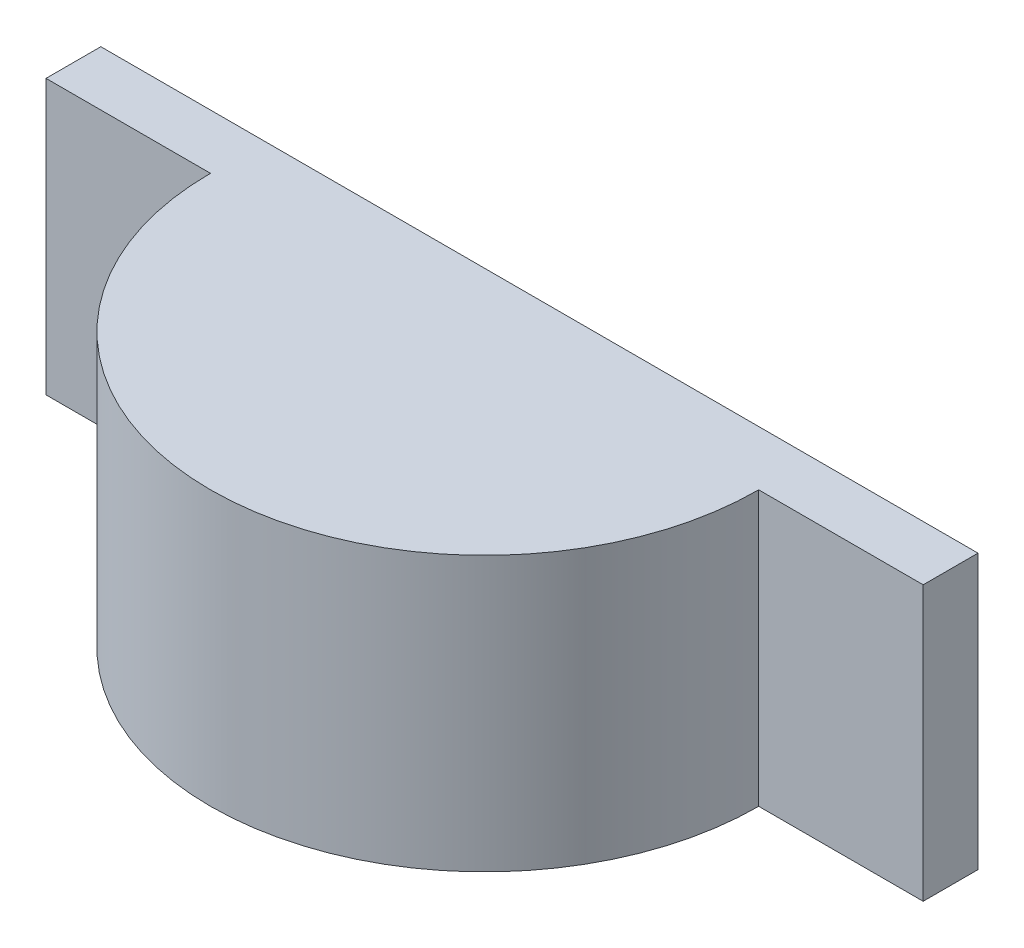
ISO-10303-21;
HEADER;
FILE_DESCRIPTION(('STEP AP214'),'2;1');
FILE_NAME('part.step','',(''),(''),'','','');
FILE_SCHEMA(('AUTOMOTIVE_DESIGN { 1 0 10303 214 1 1 1 1 }'));
ENDSEC;
DATA;
#1=APPLICATION_CONTEXT('core data for automotive mechanical design processes');
#2=APPLICATION_PROTOCOL_DEFINITION('international standard','automotive_design',2000,#1);
#3=PRODUCT_CONTEXT('',#1,'mechanical');
#4=PRODUCT('Part','Part','',(#3));
#5=PRODUCT_RELATED_PRODUCT_CATEGORY('part','',(#4));
#6=PRODUCT_DEFINITION_FORMATION('','',#4);
#7=PRODUCT_DEFINITION_CONTEXT('part definition',#1,'design');
#8=PRODUCT_DEFINITION('design','',#6,#7);
#9=PRODUCT_DEFINITION_SHAPE('','',#8);
#10=(LENGTH_UNIT() NAMED_UNIT(*) SI_UNIT(.MILLI.,.METRE.));
#11=(NAMED_UNIT(*) PLANE_ANGLE_UNIT() SI_UNIT($,.RADIAN.));
#12=(NAMED_UNIT(*) SI_UNIT($,.STERADIAN.) SOLID_ANGLE_UNIT());
#13=UNCERTAINTY_MEASURE_WITH_UNIT(LENGTH_MEASURE(1.E-05),#10,'distance_accuracy_value','');
#14=(GEOMETRIC_REPRESENTATION_CONTEXT(3) GLOBAL_UNCERTAINTY_ASSIGNED_CONTEXT((#13)) GLOBAL_UNIT_ASSIGNED_CONTEXT((#10,
#11,#12)) REPRESENTATION_CONTEXT('',''));
#15=CARTESIAN_POINT('',(0.,0.,0.));
#16=DIRECTION('',(0.,0.,1.));
#17=DIRECTION('',(1.,0.,0.));
#18=AXIS2_PLACEMENT_3D('',#15,#16,#17);
#19=CARTESIAN_POINT('',(0.,0.,10.));
#20=DIRECTION('',(0.,0.,-1.));
#21=DIRECTION('',(-1.,0.,0.));
#22=AXIS2_PLACEMENT_3D('',#19,#20,#21);
#23=PLANE('',#22);
#24=DIRECTION('',(-1.,0.,0.));
#25=VECTOR('',#24,1.);
#26=CARTESIAN_POINT('',(0.,50.,10.));
#27=LINE('',#26,#25);
#28=CARTESIAN_POINT('',(160.,50.,10.));
#29=VERTEX_POINT('',#28);
#30=CARTESIAN_POINT('',(130.,50.,10.));
#31=VERTEX_POINT('',#30);
#32=EDGE_CURVE('E47',#29,#31,#27,.T.);
#33=ORIENTED_EDGE('',*,*,#32,.T.);
#34=DIRECTION('',(0.,-1.,0.));
#35=VECTOR('',#34,1.);
#36=CARTESIAN_POINT('',(130.,161.80339887499,10.));
#37=LINE('',#36,#35);
#38=CARTESIAN_POINT('',(130.,0.,10.));
#39=VERTEX_POINT('',#38);
#40=EDGE_CURVE('E52',#31,#39,#37,.T.);
#41=ORIENTED_EDGE('',*,*,#40,.T.);
#42=DIRECTION('',(1.,0.,0.));
#43=VECTOR('',#42,1.);
#44=CARTESIAN_POINT('',(0.,0.,10.));
#45=LINE('',#44,#43);
#46=CARTESIAN_POINT('',(160.,0.,10.));
#47=VERTEX_POINT('',#46);
#48=EDGE_CURVE('E115',#39,#47,#45,.T.);
#49=ORIENTED_EDGE('',*,*,#48,.T.);
#50=DIRECTION('',(0.,1.,0.));
#51=VECTOR('',#50,1.);
#52=CARTESIAN_POINT('',(160.,0.,10.));
#53=LINE('',#52,#51);
#54=EDGE_CURVE('E93',#47,#29,#53,.T.);
#55=ORIENTED_EDGE('',*,*,#54,.T.);
#56=EDGE_LOOP('',(#33,#41,#49,#55));
#57=FACE_BOUND('',#56,.T.);
#58=ADVANCED_FACE('F32',(#57),#23,.F.);
#59=CARTESIAN_POINT('',(0.,0.,10.));
#60=DIRECTION('',(1.,0.,0.));
#61=DIRECTION('',(0.,0.,-1.));
#62=AXIS2_PLACEMENT_3D('',#59,#60,#61);
#63=PLANE('',#62);
#64=DIRECTION('',(0.,-1.,0.));
#65=VECTOR('',#64,1.);
#66=CARTESIAN_POINT('',(0.,0.,0.));
#67=LINE('',#66,#65);
#68=CARTESIAN_POINT('',(0.,50.,0.));
#69=VERTEX_POINT('',#68);
#70=CARTESIAN_POINT('',(0.,0.,0.));
#71=VERTEX_POINT('',#70);
#72=EDGE_CURVE('E105',#69,#71,#67,.T.);
#73=ORIENTED_EDGE('',*,*,#72,.T.);
#74=DIRECTION('',(0.,0.,-1.));
#75=VECTOR('',#74,1.);
#76=CARTESIAN_POINT('',(0.,0.,10.));
#77=LINE('',#76,#75);
#78=CARTESIAN_POINT('',(0.,0.,10.));
#79=VERTEX_POINT('',#78);
#80=EDGE_CURVE('E11',#79,#71,#77,.T.);
#81=ORIENTED_EDGE('',*,*,#80,.F.);
#82=DIRECTION('',(0.,-1.,0.));
#83=VECTOR('',#82,1.);
#84=CARTESIAN_POINT('',(0.,0.,10.));
#85=LINE('',#84,#83);
#86=CARTESIAN_POINT('',(0.,50.,10.));
#87=VERTEX_POINT('',#86);
#88=EDGE_CURVE('E113',#87,#79,#85,.T.);
#89=ORIENTED_EDGE('',*,*,#88,.F.);
#90=DIRECTION('',(0.,0.,-1.));
#91=VECTOR('',#90,1.);
#92=CARTESIAN_POINT('',(0.,50.,10.));
#93=LINE('',#92,#91);
#94=EDGE_CURVE('E89',#87,#69,#93,.T.);
#95=ORIENTED_EDGE('',*,*,#94,.T.);
#96=EDGE_LOOP('',(#73,#81,#89,#95));
#97=FACE_BOUND('',#96,.T.);
#98=ADVANCED_FACE('F34',(#97),#63,.F.);
#99=CARTESIAN_POINT('',(0.,0.,10.));
#100=DIRECTION('',(0.,1.,0.));
#101=DIRECTION('',(0.,0.,1.));
#102=AXIS2_PLACEMENT_3D('',#99,#100,#101);
#103=PLANE('',#102);
#104=DIRECTION('',(1.,0.,0.));
#105=VECTOR('',#104,1.);
#106=CARTESIAN_POINT('',(0.,0.,0.));
#107=LINE('',#106,#105);
#108=CARTESIAN_POINT('',(160.,0.,0.));
#109=VERTEX_POINT('',#108);
#110=EDGE_CURVE('E108',#71,#109,#107,.T.);
#111=ORIENTED_EDGE('',*,*,#110,.T.);
#112=DIRECTION('',(0.,0.,-1.));
#113=VECTOR('',#112,1.);
#114=CARTESIAN_POINT('',(160.,0.,10.));
#115=LINE('',#114,#113);
#116=EDGE_CURVE('E40',#47,#109,#115,.T.);
#117=ORIENTED_EDGE('',*,*,#116,.F.);
#118=ORIENTED_EDGE('',*,*,#48,.F.);
#119=CARTESIAN_POINT('',(80.,0.,10.));
#120=DIRECTION('',(0.,-1.,0.));
#121=DIRECTION('',(0.,0.,-1.));
#122=AXIS2_PLACEMENT_3D('',#119,#120,#121);
#123=CIRCLE('',#122,50.);
#124=CARTESIAN_POINT('',(30.,0.,10.));
#125=VERTEX_POINT('',#124);
#126=EDGE_CURVE('E102',#39,#125,#123,.T.);
#127=ORIENTED_EDGE('',*,*,#126,.T.);
#128=EDGE_CURVE('E98',#79,#125,#45,.T.);
#129=ORIENTED_EDGE('',*,*,#128,.F.);
#130=ORIENTED_EDGE('',*,*,#80,.T.);
#131=EDGE_LOOP('',(#111,#117,#118,#127,#129,#130));
#132=FACE_BOUND('',#131,.T.);
#133=ADVANCED_FACE('F140',(#132),#103,.F.);
#134=CARTESIAN_POINT('',(160.,0.,10.));
#135=DIRECTION('',(-1.,0.,0.));
#136=DIRECTION('',(0.,0.,1.));
#137=AXIS2_PLACEMENT_3D('',#134,#135,#136);
#138=PLANE('',#137);
#139=DIRECTION('',(0.,1.,0.));
#140=VECTOR('',#139,1.);
#141=CARTESIAN_POINT('',(160.,0.,0.));
#142=LINE('',#141,#140);
#143=CARTESIAN_POINT('',(160.,50.,0.));
#144=VERTEX_POINT('',#143);
#145=EDGE_CURVE('E120',#109,#144,#142,.T.);
#146=ORIENTED_EDGE('',*,*,#145,.T.);
#147=DIRECTION('',(0.,0.,-1.));
#148=VECTOR('',#147,1.);
#149=CARTESIAN_POINT('',(160.,50.,10.));
#150=LINE('',#149,#148);
#151=EDGE_CURVE('E124',#29,#144,#150,.T.);
#152=ORIENTED_EDGE('',*,*,#151,.F.);
#153=ORIENTED_EDGE('',*,*,#54,.F.);
#154=ORIENTED_EDGE('',*,*,#116,.T.);
#155=EDGE_LOOP('',(#146,#152,#153,#154));
#156=FACE_BOUND('',#155,.T.);
#157=ADVANCED_FACE('F131',(#156),#138,.F.);
#158=CARTESIAN_POINT('',(0.,50.,10.));
#159=DIRECTION('',(0.,-1.,0.));
#160=DIRECTION('',(0.,0.,-1.));
#161=AXIS2_PLACEMENT_3D('',#158,#159,#160);
#162=PLANE('',#161);
#163=DIRECTION('',(-1.,0.,0.));
#164=VECTOR('',#163,1.);
#165=CARTESIAN_POINT('',(0.,50.,0.));
#166=LINE('',#165,#164);
#167=EDGE_CURVE('E116',#144,#69,#166,.T.);
#168=ORIENTED_EDGE('',*,*,#167,.T.);
#169=ORIENTED_EDGE('',*,*,#94,.F.);
#170=CARTESIAN_POINT('',(30.,50.,10.));
#171=VERTEX_POINT('',#170);
#172=EDGE_CURVE('E83',#171,#87,#27,.T.);
#173=ORIENTED_EDGE('',*,*,#172,.F.);
#174=CARTESIAN_POINT('',(80.,50.,10.));
#175=DIRECTION('',(0.,-1.,0.));
#176=DIRECTION('',(0.,0.,-1.));
#177=AXIS2_PLACEMENT_3D('',#174,#175,#176);
#178=CIRCLE('',#177,50.);
#179=EDGE_CURVE('E87',#171,#31,#178,.F.);
#180=ORIENTED_EDGE('',*,*,#179,.T.);
#181=ORIENTED_EDGE('',*,*,#32,.F.);
#182=ORIENTED_EDGE('',*,*,#151,.T.);
#183=EDGE_LOOP('',(#168,#169,#173,#180,#181,#182));
#184=FACE_BOUND('',#183,.T.);
#185=ADVANCED_FACE('F85',(#184),#162,.F.);
#186=ORIENTED_EDGE('',*,*,#128,.T.);
#187=DIRECTION('',(0.,-1.,0.));
#188=VECTOR('',#187,1.);
#189=CARTESIAN_POINT('',(30.,161.80339887499,10.));
#190=LINE('',#189,#188);
#191=EDGE_CURVE('E96',#171,#125,#190,.T.);
#192=ORIENTED_EDGE('',*,*,#191,.F.);
#193=ORIENTED_EDGE('',*,*,#172,.T.);
#194=ORIENTED_EDGE('',*,*,#88,.T.);
#195=EDGE_LOOP('',(#186,#192,#193,#194));
#196=FACE_BOUND('',#195,.T.);
#197=ADVANCED_FACE('F97',(#196),#23,.F.);
#198=CARTESIAN_POINT('',(0.,0.,0.));
#199=DIRECTION('',(0.,0.,-1.));
#200=DIRECTION('',(-1.,0.,0.));
#201=AXIS2_PLACEMENT_3D('',#198,#199,#200);
#202=PLANE('',#201);
#203=ORIENTED_EDGE('',*,*,#72,.F.);
#204=ORIENTED_EDGE('',*,*,#167,.F.);
#205=ORIENTED_EDGE('',*,*,#145,.F.);
#206=ORIENTED_EDGE('',*,*,#110,.F.);
#207=EDGE_LOOP('',(#203,#204,#205,#206));
#208=FACE_BOUND('',#207,.T.);
#209=ADVANCED_FACE('F137',(#208),#202,.T.);
#210=CARTESIAN_POINT('',(80.,161.80339887499,10.));
#211=DIRECTION('',(0.,-1.,0.));
#212=DIRECTION('',(0.,0.,-1.));
#213=AXIS2_PLACEMENT_3D('',#210,#211,#212);
#214=CYLINDRICAL_SURFACE('',#213,50.);
#215=ORIENTED_EDGE('',*,*,#179,.F.);
#216=ORIENTED_EDGE('',*,*,#191,.T.);
#217=ORIENTED_EDGE('',*,*,#126,.F.);
#218=ORIENTED_EDGE('',*,*,#40,.F.);
#219=EDGE_LOOP('',(#215,#216,#217,#218));
#220=FACE_BOUND('',#219,.T.);
#221=ADVANCED_FACE('F104',(#220),#214,.T.);
#222=CLOSED_SHELL('',(#58,#98,#133,#157,#185,#197,#209,#221));
#223=MANIFOLD_SOLID_BREP('B2',#222);
#224=ADVANCED_BREP_SHAPE_REPRESENTATION('',(#18,#223),#14);
#225=SHAPE_DEFINITION_REPRESENTATION(#9,#224);
ENDSEC;
END-ISO-10303-21;
